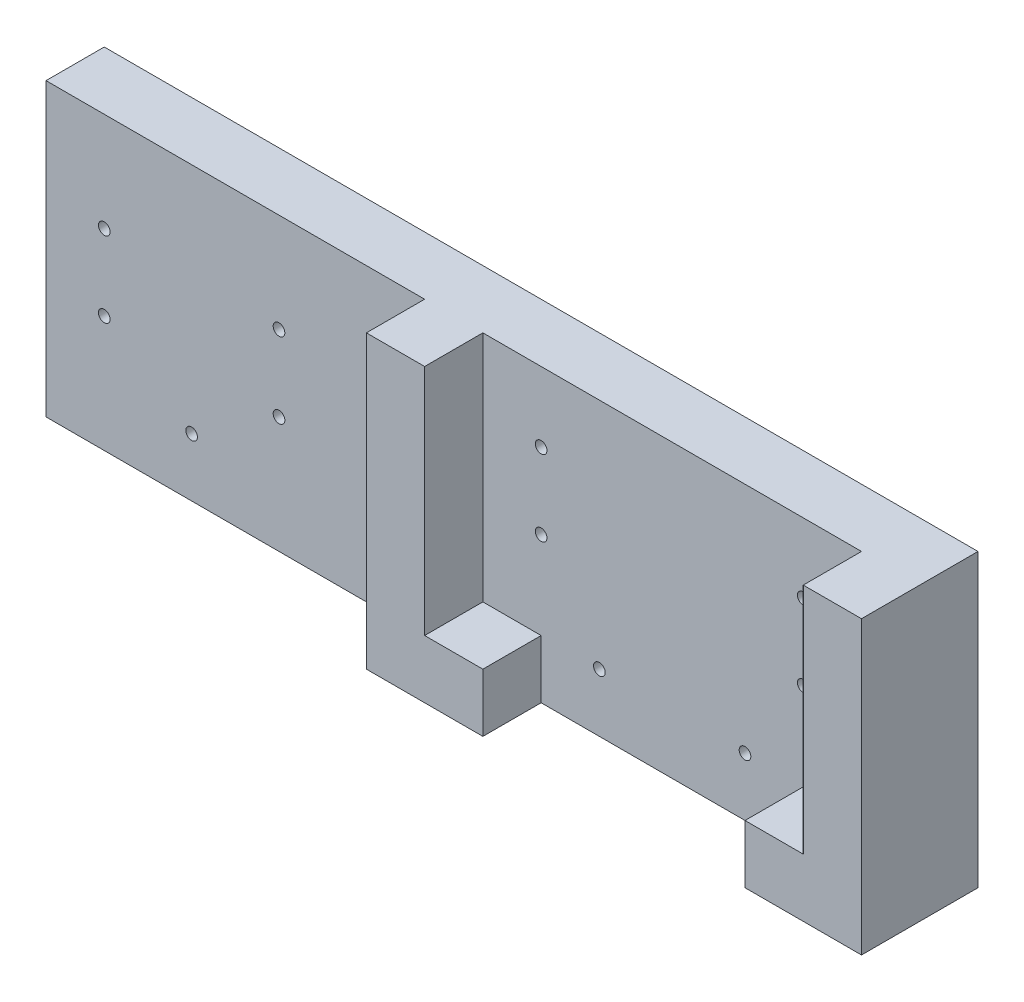
ISO-10303-21;
HEADER;
FILE_DESCRIPTION(('STEP AP214'),'2;1');
FILE_NAME('part.step','',(''),(''),'','','');
FILE_SCHEMA(('AUTOMOTIVE_DESIGN { 1 0 10303 214 1 1 1 1 }'));
ENDSEC;
DATA;
#1=APPLICATION_CONTEXT('core data for automotive mechanical design processes');
#2=APPLICATION_PROTOCOL_DEFINITION('international standard','automotive_design',2000,#1);
#3=PRODUCT_CONTEXT('',#1,'mechanical');
#4=PRODUCT('Part','Part','',(#3));
#5=PRODUCT_RELATED_PRODUCT_CATEGORY('part','',(#4));
#6=PRODUCT_DEFINITION_FORMATION('','',#4);
#7=PRODUCT_DEFINITION_CONTEXT('part definition',#1,'design');
#8=PRODUCT_DEFINITION('design','',#6,#7);
#9=PRODUCT_DEFINITION_SHAPE('','',#8);
#10=(LENGTH_UNIT() NAMED_UNIT(*) SI_UNIT(.MILLI.,.METRE.));
#11=(NAMED_UNIT(*) PLANE_ANGLE_UNIT() SI_UNIT($,.RADIAN.));
#12=(NAMED_UNIT(*) SI_UNIT($,.STERADIAN.) SOLID_ANGLE_UNIT());
#13=UNCERTAINTY_MEASURE_WITH_UNIT(LENGTH_MEASURE(1.E-05),#10,'distance_accuracy_value','');
#14=(GEOMETRIC_REPRESENTATION_CONTEXT(3) GLOBAL_UNCERTAINTY_ASSIGNED_CONTEXT((#13)) GLOBAL_UNIT_ASSIGNED_CONTEXT((#10,
#11,#12)) REPRESENTATION_CONTEXT('',''));
#15=CARTESIAN_POINT('',(0.,0.,0.));
#16=DIRECTION('',(0.,0.,1.));
#17=DIRECTION('',(1.,0.,0.));
#18=AXIS2_PLACEMENT_3D('',#15,#16,#17);
#19=CARTESIAN_POINT('',(0.,0.,-20.));
#20=DIRECTION('',(0.,0.,1.));
#21=DIRECTION('',(1.,0.,0.));
#22=AXIS2_PLACEMENT_3D('',#19,#20,#21);
#23=PLANE('',#22);
#24=CARTESIAN_POINT('',(-61.1414341617116,19.5358217023107,-20.));
#25=DIRECTION('',(0.,0.,-1.));
#26=DIRECTION('',(-1.,0.,0.));
#27=AXIS2_PLACEMENT_3D('',#24,#25,#26);
#28=CIRCLE('',#27,1.00000000000001);
#29=CARTESIAN_POINT('',(-62.1414341617116,19.5358217023107,-20.));
#30=VERTEX_POINT('',#29);
#31=EDGE_CURVE('E223',#30,#30,#28,.T.);
#32=ORIENTED_EDGE('',*,*,#31,.T.);
#33=EDGE_LOOP('',(#32));
#34=FACE_BOUND('',#33,.T.);
#35=CARTESIAN_POINT('',(-46.1414341617116,42.5358217023106,-20.));
#36=DIRECTION('',(0.,0.,-1.));
#37=DIRECTION('',(-1.,0.,0.));
#38=AXIS2_PLACEMENT_3D('',#35,#36,#37);
#39=CIRCLE('',#38,0.999999999999998);
#40=CARTESIAN_POINT('',(-47.1414341617116,42.5358217023106,-20.));
#41=VERTEX_POINT('',#40);
#42=EDGE_CURVE('E233',#41,#41,#39,.T.);
#43=ORIENTED_EDGE('',*,*,#42,.T.);
#44=EDGE_LOOP('',(#43));
#45=FACE_BOUND('',#44,.T.);
#46=CARTESIAN_POINT('',(-76.1414341617116,29.5358217023107,-20.));
#47=DIRECTION('',(0.,0.,-1.));
#48=DIRECTION('',(-1.,0.,0.));
#49=AXIS2_PLACEMENT_3D('',#46,#47,#48);
#50=CIRCLE('',#49,1.00000000000001);
#51=CARTESIAN_POINT('',(-77.1414341617117,29.5358217023107,-20.));
#52=VERTEX_POINT('',#51);
#53=EDGE_CURVE('E245',#52,#52,#50,.T.);
#54=ORIENTED_EDGE('',*,*,#53,.T.);
#55=EDGE_LOOP('',(#54));
#56=FACE_BOUND('',#55,.T.);
#57=CARTESIAN_POINT('',(-76.1414341617116,42.5358217023106,-20.));
#58=DIRECTION('',(0.,0.,-1.));
#59=DIRECTION('',(-1.,0.,0.));
#60=AXIS2_PLACEMENT_3D('',#57,#58,#59);
#61=CIRCLE('',#60,1.00000000000001);
#62=CARTESIAN_POINT('',(-77.1414341617117,42.5358217023106,-20.));
#63=VERTEX_POINT('',#62);
#64=EDGE_CURVE('E239',#63,#63,#61,.T.);
#65=ORIENTED_EDGE('',*,*,#64,.T.);
#66=EDGE_LOOP('',(#65));
#67=FACE_BOUND('',#66,.T.);
#68=CARTESIAN_POINT('',(-46.1414341617116,29.5358217023107,-20.));
#69=DIRECTION('',(0.,0.,-1.));
#70=DIRECTION('',(-1.,0.,0.));
#71=AXIS2_PLACEMENT_3D('',#68,#69,#70);
#72=CIRCLE('',#71,0.999999999999998);
#73=CARTESIAN_POINT('',(-47.1414341617116,29.5358217023107,-20.));
#74=VERTEX_POINT('',#73);
#75=EDGE_CURVE('E227',#74,#74,#72,.T.);
#76=ORIENTED_EDGE('',*,*,#75,.T.);
#77=EDGE_LOOP('',(#76));
#78=FACE_BOUND('',#77,.T.);
#79=DIRECTION('',(-1.,0.,0.));
#80=VECTOR('',#79,1.);
#81=CARTESIAN_POINT('',(63.8585658382884,9.53582170231052,-20.));
#82=LINE('',#81,#80);
#83=CARTESIAN_POINT('',(-21.1414341617117,9.53582170231054,-20.));
#84=VERTEX_POINT('',#83);
#85=CARTESIAN_POINT('',(-86.1414341617116,9.53582170231056,-20.));
#86=VERTEX_POINT('',#85);
#87=EDGE_CURVE('E304',#84,#86,#82,.T.);
#88=ORIENTED_EDGE('',*,*,#87,.F.);
#89=DIRECTION('',(0.,1.,0.));
#90=VECTOR('',#89,1.);
#91=CARTESIAN_POINT('',(-21.1414341617117,0.,-20.));
#92=LINE('',#91,#90);
#93=CARTESIAN_POINT('',(-21.1414341617117,59.5358217023105,-20.));
#94=VERTEX_POINT('',#93);
#95=EDGE_CURVE('E203',#84,#94,#92,.T.);
#96=ORIENTED_EDGE('',*,*,#95,.T.);
#97=DIRECTION('',(1.,0.,0.));
#98=VECTOR('',#97,1.);
#99=CARTESIAN_POINT('',(63.8585658382884,59.5358217023105,-20.));
#100=LINE('',#99,#98);
#101=CARTESIAN_POINT('',(-86.1414341617116,59.5358217023106,-20.));
#102=VERTEX_POINT('',#101);
#103=EDGE_CURVE('E301',#102,#94,#100,.T.);
#104=ORIENTED_EDGE('',*,*,#103,.F.);
#105=DIRECTION('',(0.,1.,0.));
#106=VECTOR('',#105,1.);
#107=CARTESIAN_POINT('',(-86.1414341617116,59.5358217023106,-20.));
#108=LINE('',#107,#106);
#109=EDGE_CURVE('E294',#86,#102,#108,.T.);
#110=ORIENTED_EDGE('',*,*,#109,.F.);
#111=EDGE_LOOP('',(#88,#96,#104,#110));
#112=FACE_BOUND('',#111,.T.);
#113=ADVANCED_FACE('F39',(#34,#45,#56,#67,#78,#112),#23,.T.);
#114=CARTESIAN_POINT('',(0.,0.,-30.));
#115=DIRECTION('',(0.,0.,1.));
#116=DIRECTION('',(1.,0.,0.));
#117=AXIS2_PLACEMENT_3D('',#114,#115,#116);
#118=PLANE('',#117);
#119=DIRECTION('',(1.,0.,0.));
#120=VECTOR('',#119,1.);
#121=CARTESIAN_POINT('',(63.8585658382884,59.5358217023105,-30.));
#122=LINE('',#121,#120);
#123=CARTESIAN_POINT('',(-86.1414341617116,59.5358217023106,-30.));
#124=VERTEX_POINT('',#123);
#125=CARTESIAN_POINT('',(63.8585658382884,59.5358217023105,-30.));
#126=VERTEX_POINT('',#125);
#127=EDGE_CURVE('E290',#124,#126,#122,.T.);
#128=ORIENTED_EDGE('',*,*,#127,.T.);
#129=DIRECTION('',(0.,-1.,0.));
#130=VECTOR('',#129,1.);
#131=CARTESIAN_POINT('',(63.8585658382884,59.5358217023105,-30.));
#132=LINE('',#131,#130);
#133=CARTESIAN_POINT('',(63.8585658382884,9.53582170231052,-30.));
#134=VERTEX_POINT('',#133);
#135=EDGE_CURVE('E293',#126,#134,#132,.T.);
#136=ORIENTED_EDGE('',*,*,#135,.T.);
#137=DIRECTION('',(-1.,0.,0.));
#138=VECTOR('',#137,1.);
#139=CARTESIAN_POINT('',(63.8585658382884,9.53582170231052,-30.));
#140=LINE('',#139,#138);
#141=CARTESIAN_POINT('',(-86.1414341617116,9.53582170231056,-30.));
#142=VERTEX_POINT('',#141);
#143=EDGE_CURVE('E296',#134,#142,#140,.T.);
#144=ORIENTED_EDGE('',*,*,#143,.T.);
#145=DIRECTION('',(0.,1.,0.));
#146=VECTOR('',#145,1.);
#147=CARTESIAN_POINT('',(-86.1414341617116,59.5358217023106,-30.));
#148=LINE('',#147,#146);
#149=EDGE_CURVE('E298',#142,#124,#148,.T.);
#150=ORIENTED_EDGE('',*,*,#149,.T.);
#151=EDGE_LOOP('',(#128,#136,#144,#150));
#152=FACE_BOUND('',#151,.T.);
#153=CARTESIAN_POINT('',(43.8585658382883,47.5358217023105,-30.));
#154=DIRECTION('',(0.,0.,-1.));
#155=DIRECTION('',(-1.,0.,0.));
#156=AXIS2_PLACEMENT_3D('',#153,#154,#155);
#157=CIRCLE('',#156,0.999999999999998);
#158=CARTESIAN_POINT('',(42.8585658382883,47.5358217023105,-30.));
#159=VERTEX_POINT('',#158);
#160=EDGE_CURVE('E284',#159,#159,#157,.T.);
#161=ORIENTED_EDGE('',*,*,#160,.F.);
#162=EDGE_LOOP('',(#161));
#163=FACE_BOUND('',#162,.T.);
#164=CARTESIAN_POINT('',(43.8585658382884,34.5358217023105,-30.));
#165=DIRECTION('',(0.,0.,-1.));
#166=DIRECTION('',(-1.,0.,0.));
#167=AXIS2_PLACEMENT_3D('',#164,#165,#166);
#168=CIRCLE('',#167,1.00000000000001);
#169=CARTESIAN_POINT('',(42.8585658382883,34.5358217023105,-30.));
#170=VERTEX_POINT('',#169);
#171=EDGE_CURVE('E278',#170,#170,#168,.T.);
#172=ORIENTED_EDGE('',*,*,#171,.F.);
#173=EDGE_LOOP('',(#172));
#174=FACE_BOUND('',#173,.T.);
#175=CARTESIAN_POINT('',(-1.14143416171164,34.5358217023105,-30.));
#176=DIRECTION('',(0.,0.,-1.));
#177=DIRECTION('',(-1.,0.,0.));
#178=AXIS2_PLACEMENT_3D('',#175,#176,#177);
#179=CIRCLE('',#178,1.);
#180=CARTESIAN_POINT('',(-2.14143416171164,34.5358217023105,-30.));
#181=VERTEX_POINT('',#180);
#182=EDGE_CURVE('E272',#181,#181,#179,.T.);
#183=ORIENTED_EDGE('',*,*,#182,.F.);
#184=EDGE_LOOP('',(#183));
#185=FACE_BOUND('',#184,.T.);
#186=CARTESIAN_POINT('',(-1.1414341617116,47.5358217023105,-30.));
#187=DIRECTION('',(0.,0.,-1.));
#188=DIRECTION('',(-1.,0.,0.));
#189=AXIS2_PLACEMENT_3D('',#186,#187,#188);
#190=CIRCLE('',#189,0.999999999999933);
#191=CARTESIAN_POINT('',(-2.14143416171153,47.5358217023105,-30.));
#192=VERTEX_POINT('',#191);
#193=EDGE_CURVE('E266',#192,#192,#190,.T.);
#194=ORIENTED_EDGE('',*,*,#193,.F.);
#195=EDGE_LOOP('',(#194));
#196=FACE_BOUND('',#195,.T.);
#197=CARTESIAN_POINT('',(8.85856583828836,19.5358217023105,-30.));
#198=DIRECTION('',(0.,0.,-1.));
#199=DIRECTION('',(-1.,0.,0.));
#200=AXIS2_PLACEMENT_3D('',#197,#198,#199);
#201=CIRCLE('',#200,1.);
#202=CARTESIAN_POINT('',(7.85856583828836,19.5358217023105,-30.));
#203=VERTEX_POINT('',#202);
#204=EDGE_CURVE('E260',#203,#203,#201,.T.);
#205=ORIENTED_EDGE('',*,*,#204,.F.);
#206=EDGE_LOOP('',(#205));
#207=FACE_BOUND('',#206,.T.);
#208=CARTESIAN_POINT('',(33.8585658382884,19.5358217023105,-30.));
#209=DIRECTION('',(0.,0.,-1.));
#210=DIRECTION('',(-1.,0.,0.));
#211=AXIS2_PLACEMENT_3D('',#208,#209,#210);
#212=CIRCLE('',#211,0.999999999999998);
#213=CARTESIAN_POINT('',(32.8585658382884,19.5358217023105,-30.));
#214=VERTEX_POINT('',#213);
#215=EDGE_CURVE('E254',#214,#214,#212,.T.);
#216=ORIENTED_EDGE('',*,*,#215,.F.);
#217=EDGE_LOOP('',(#216));
#218=FACE_BOUND('',#217,.T.);
#219=CARTESIAN_POINT('',(-76.1414341617116,29.5358217023107,-30.));
#220=DIRECTION('',(0.,0.,-1.));
#221=DIRECTION('',(-1.,0.,0.));
#222=AXIS2_PLACEMENT_3D('',#219,#220,#221);
#223=CIRCLE('',#222,1.00000000000001);
#224=CARTESIAN_POINT('',(-77.1414341617117,29.5358217023107,-30.));
#225=VERTEX_POINT('',#224);
#226=EDGE_CURVE('E248',#225,#225,#223,.T.);
#227=ORIENTED_EDGE('',*,*,#226,.F.);
#228=EDGE_LOOP('',(#227));
#229=FACE_BOUND('',#228,.T.);
#230=CARTESIAN_POINT('',(-76.1414341617116,42.5358217023106,-30.));
#231=DIRECTION('',(0.,0.,-1.));
#232=DIRECTION('',(-1.,0.,0.));
#233=AXIS2_PLACEMENT_3D('',#230,#231,#232);
#234=CIRCLE('',#233,1.00000000000001);
#235=CARTESIAN_POINT('',(-77.1414341617117,42.5358217023106,-30.));
#236=VERTEX_POINT('',#235);
#237=EDGE_CURVE('E242',#236,#236,#234,.T.);
#238=ORIENTED_EDGE('',*,*,#237,.F.);
#239=EDGE_LOOP('',(#238));
#240=FACE_BOUND('',#239,.T.);
#241=CARTESIAN_POINT('',(-46.1414341617116,42.5358217023106,-30.));
#242=DIRECTION('',(0.,0.,-1.));
#243=DIRECTION('',(-1.,0.,0.));
#244=AXIS2_PLACEMENT_3D('',#241,#242,#243);
#245=CIRCLE('',#244,0.999999999999998);
#246=CARTESIAN_POINT('',(-47.1414341617116,42.5358217023106,-30.));
#247=VERTEX_POINT('',#246);
#248=EDGE_CURVE('E236',#247,#247,#245,.T.);
#249=ORIENTED_EDGE('',*,*,#248,.F.);
#250=EDGE_LOOP('',(#249));
#251=FACE_BOUND('',#250,.T.);
#252=CARTESIAN_POINT('',(-46.1414341617116,29.5358217023107,-30.));
#253=DIRECTION('',(0.,0.,-1.));
#254=DIRECTION('',(-1.,0.,0.));
#255=AXIS2_PLACEMENT_3D('',#252,#253,#254);
#256=CIRCLE('',#255,0.999999999999998);
#257=CARTESIAN_POINT('',(-47.1414341617116,29.5358217023107,-30.));
#258=VERTEX_POINT('',#257);
#259=EDGE_CURVE('E230',#258,#258,#256,.T.);
#260=ORIENTED_EDGE('',*,*,#259,.F.);
#261=EDGE_LOOP('',(#260));
#262=FACE_BOUND('',#261,.T.);
#263=CARTESIAN_POINT('',(-61.1414341617116,19.5358217023107,-30.));
#264=DIRECTION('',(0.,0.,-1.));
#265=DIRECTION('',(-1.,0.,0.));
#266=AXIS2_PLACEMENT_3D('',#263,#264,#265);
#267=CIRCLE('',#266,1.00000000000001);
#268=CARTESIAN_POINT('',(-62.1414341617116,19.5358217023107,-30.));
#269=VERTEX_POINT('',#268);
#270=EDGE_CURVE('E224',#269,#269,#267,.T.);
#271=ORIENTED_EDGE('',*,*,#270,.F.);
#272=EDGE_LOOP('',(#271));
#273=FACE_BOUND('',#272,.T.);
#274=ADVANCED_FACE('F341',(#152,#163,#174,#185,#196,#207,#218,#229,#240,#251,#262,#273),#118,.F.);
#275=DIRECTION('',(0.,1.,0.));
#276=VECTOR('',#275,1.);
#277=CARTESIAN_POINT('',(53.8585658382884,0.,-20.));
#278=LINE('',#277,#276);
#279=CARTESIAN_POINT('',(53.8585658382884,19.5358217023105,-20.));
#280=VERTEX_POINT('',#279);
#281=CARTESIAN_POINT('',(53.8585658382883,59.5358217023105,-20.));
#282=VERTEX_POINT('',#281);
#283=EDGE_CURVE('E145',#280,#282,#278,.T.);
#284=ORIENTED_EDGE('',*,*,#283,.T.);
#285=CARTESIAN_POINT('',(-11.1414341617117,59.5358217023105,-20.));
#286=VERTEX_POINT('',#285);
#287=EDGE_CURVE('E287',#286,#282,#100,.T.);
#288=ORIENTED_EDGE('',*,*,#287,.F.);
#289=DIRECTION('',(0.,1.,0.));
#290=VECTOR('',#289,1.);
#291=CARTESIAN_POINT('',(-11.1414341617117,0.,-20.));
#292=LINE('',#291,#290);
#293=CARTESIAN_POINT('',(-11.1414341617117,19.5358217023105,-20.));
#294=VERTEX_POINT('',#293);
#295=EDGE_CURVE('E200',#294,#286,#292,.T.);
#296=ORIENTED_EDGE('',*,*,#295,.F.);
#297=DIRECTION('',(1.,0.,0.));
#298=VECTOR('',#297,1.);
#299=CARTESIAN_POINT('',(0.,19.5358217023105,-20.));
#300=LINE('',#299,#298);
#301=CARTESIAN_POINT('',(-1.14143416171164,19.5358217023105,-20.));
#302=VERTEX_POINT('',#301);
#303=EDGE_CURVE('E62',#294,#302,#300,.T.);
#304=ORIENTED_EDGE('',*,*,#303,.T.);
#305=DIRECTION('',(0.,1.,0.));
#306=VECTOR('',#305,1.);
#307=CARTESIAN_POINT('',(-1.14143416171164,0.,-20.));
#308=LINE('',#307,#306);
#309=CARTESIAN_POINT('',(-1.14143416171164,9.53582170231054,-20.));
#310=VERTEX_POINT('',#309);
#311=EDGE_CURVE('E187',#310,#302,#308,.T.);
#312=ORIENTED_EDGE('',*,*,#311,.F.);
#313=CARTESIAN_POINT('',(43.8585658382884,9.53582170231052,-20.));
#314=VERTEX_POINT('',#313);
#315=EDGE_CURVE('E305',#314,#310,#82,.T.);
#316=ORIENTED_EDGE('',*,*,#315,.F.);
#317=DIRECTION('',(0.,1.,0.));
#318=VECTOR('',#317,1.);
#319=CARTESIAN_POINT('',(43.8585658382884,0.,-20.));
#320=LINE('',#319,#318);
#321=CARTESIAN_POINT('',(43.8585658382884,19.5358217023105,-20.));
#322=VERTEX_POINT('',#321);
#323=EDGE_CURVE('E54',#314,#322,#320,.T.);
#324=ORIENTED_EDGE('',*,*,#323,.T.);
#325=DIRECTION('',(1.,0.,0.));
#326=VECTOR('',#325,1.);
#327=CARTESIAN_POINT('',(0.,19.5358217023105,-20.));
#328=LINE('',#327,#326);
#329=EDGE_CURVE('E176',#322,#280,#328,.T.);
#330=ORIENTED_EDGE('',*,*,#329,.T.);
#331=EDGE_LOOP('',(#284,#288,#296,#304,#312,#316,#324,#330));
#332=FACE_BOUND('',#331,.T.);
#333=CARTESIAN_POINT('',(33.8585658382884,19.5358217023105,-20.));
#334=DIRECTION('',(0.,0.,-1.));
#335=DIRECTION('',(-1.,0.,0.));
#336=AXIS2_PLACEMENT_3D('',#333,#334,#335);
#337=CIRCLE('',#336,0.999999999999998);
#338=CARTESIAN_POINT('',(32.8585658382884,19.5358217023105,-20.));
#339=VERTEX_POINT('',#338);
#340=EDGE_CURVE('E251',#339,#339,#337,.T.);
#341=ORIENTED_EDGE('',*,*,#340,.T.);
#342=EDGE_LOOP('',(#341));
#343=FACE_BOUND('',#342,.T.);
#344=CARTESIAN_POINT('',(-1.1414341617116,47.5358217023105,-20.));
#345=DIRECTION('',(0.,0.,-1.));
#346=DIRECTION('',(-1.,0.,0.));
#347=AXIS2_PLACEMENT_3D('',#344,#345,#346);
#348=CIRCLE('',#347,0.999999999999933);
#349=CARTESIAN_POINT('',(-2.14143416171153,47.5358217023105,-20.));
#350=VERTEX_POINT('',#349);
#351=EDGE_CURVE('E263',#350,#350,#348,.T.);
#352=ORIENTED_EDGE('',*,*,#351,.T.);
#353=EDGE_LOOP('',(#352));
#354=FACE_BOUND('',#353,.T.);
#355=CARTESIAN_POINT('',(43.8585658382884,34.5358217023105,-20.));
#356=DIRECTION('',(0.,0.,-1.));
#357=DIRECTION('',(-1.,0.,0.));
#358=AXIS2_PLACEMENT_3D('',#355,#356,#357);
#359=CIRCLE('',#358,1.00000000000001);
#360=CARTESIAN_POINT('',(42.8585658382883,34.5358217023105,-20.));
#361=VERTEX_POINT('',#360);
#362=EDGE_CURVE('E275',#361,#361,#359,.T.);
#363=ORIENTED_EDGE('',*,*,#362,.T.);
#364=EDGE_LOOP('',(#363));
#365=FACE_BOUND('',#364,.T.);
#366=CARTESIAN_POINT('',(43.8585658382883,47.5358217023105,-20.));
#367=DIRECTION('',(0.,0.,-1.));
#368=DIRECTION('',(-1.,0.,0.));
#369=AXIS2_PLACEMENT_3D('',#366,#367,#368);
#370=CIRCLE('',#369,0.999999999999998);
#371=CARTESIAN_POINT('',(42.8585658382883,47.5358217023105,-20.));
#372=VERTEX_POINT('',#371);
#373=EDGE_CURVE('E281',#372,#372,#370,.T.);
#374=ORIENTED_EDGE('',*,*,#373,.T.);
#375=EDGE_LOOP('',(#374));
#376=FACE_BOUND('',#375,.T.);
#377=CARTESIAN_POINT('',(-1.14143416171164,34.5358217023105,-20.));
#378=DIRECTION('',(0.,0.,-1.));
#379=DIRECTION('',(-1.,0.,0.));
#380=AXIS2_PLACEMENT_3D('',#377,#378,#379);
#381=CIRCLE('',#380,1.);
#382=CARTESIAN_POINT('',(-2.14143416171164,34.5358217023105,-20.));
#383=VERTEX_POINT('',#382);
#384=EDGE_CURVE('E269',#383,#383,#381,.T.);
#385=ORIENTED_EDGE('',*,*,#384,.T.);
#386=EDGE_LOOP('',(#385));
#387=FACE_BOUND('',#386,.T.);
#388=CARTESIAN_POINT('',(8.85856583828836,19.5358217023105,-20.));
#389=DIRECTION('',(0.,0.,-1.));
#390=DIRECTION('',(-1.,0.,0.));
#391=AXIS2_PLACEMENT_3D('',#388,#389,#390);
#392=CIRCLE('',#391,1.);
#393=CARTESIAN_POINT('',(7.85856583828836,19.5358217023105,-20.));
#394=VERTEX_POINT('',#393);
#395=EDGE_CURVE('E257',#394,#394,#392,.T.);
#396=ORIENTED_EDGE('',*,*,#395,.T.);
#397=EDGE_LOOP('',(#396));
#398=FACE_BOUND('',#397,.T.);
#399=ADVANCED_FACE('F325',(#332,#343,#354,#365,#376,#387,#398),#23,.T.);
#400=CARTESIAN_POINT('',(63.8585658382884,59.5358217023105,-30.));
#401=DIRECTION('',(0.,-1.,0.));
#402=DIRECTION('',(1.,0.,0.));
#403=AXIS2_PLACEMENT_3D('',#400,#401,#402);
#404=PLANE('',#403);
#405=ORIENTED_EDGE('',*,*,#103,.T.);
#406=DIRECTION('',(0.,0.,-1.));
#407=VECTOR('',#406,1.);
#408=CARTESIAN_POINT('',(-21.1414341617117,59.5358217023106,-10.));
#409=LINE('',#408,#407);
#410=CARTESIAN_POINT('',(-21.1414341617117,59.5358217023106,-10.));
#411=VERTEX_POINT('',#410);
#412=EDGE_CURVE('E214',#411,#94,#409,.T.);
#413=ORIENTED_EDGE('',*,*,#412,.F.);
#414=DIRECTION('',(-1.,0.,0.));
#415=VECTOR('',#414,1.);
#416=CARTESIAN_POINT('',(0.,59.5358217023105,-10.));
#417=LINE('',#416,#415);
#418=CARTESIAN_POINT('',(-11.1414341617117,59.5358217023105,-10.));
#419=VERTEX_POINT('',#418);
#420=EDGE_CURVE('E189',#419,#411,#417,.T.);
#421=ORIENTED_EDGE('',*,*,#420,.F.);
#422=DIRECTION('',(0.,0.,-1.));
#423=VECTOR('',#422,1.);
#424=CARTESIAN_POINT('',(-11.1414341617117,59.5358217023105,-10.));
#425=LINE('',#424,#423);
#426=EDGE_CURVE('E217',#419,#286,#425,.T.);
#427=ORIENTED_EDGE('',*,*,#426,.T.);
#428=ORIENTED_EDGE('',*,*,#287,.T.);
#429=DIRECTION('',(0.,0.,-1.));
#430=VECTOR('',#429,1.);
#431=CARTESIAN_POINT('',(53.8585658382883,59.5358217023105,-10.));
#432=LINE('',#431,#430);
#433=CARTESIAN_POINT('',(53.8585658382883,59.5358217023105,-10.));
#434=VERTEX_POINT('',#433);
#435=EDGE_CURVE('E174',#434,#282,#432,.T.);
#436=ORIENTED_EDGE('',*,*,#435,.F.);
#437=DIRECTION('',(-1.,0.,0.));
#438=VECTOR('',#437,1.);
#439=CARTESIAN_POINT('',(0.,59.5358217023105,-10.));
#440=LINE('',#439,#438);
#441=CARTESIAN_POINT('',(63.8585658382884,59.5358217023105,-10.));
#442=VERTEX_POINT('',#441);
#443=EDGE_CURVE('E160',#442,#434,#440,.T.);
#444=ORIENTED_EDGE('',*,*,#443,.F.);
#445=DIRECTION('',(0.,0.,1.));
#446=VECTOR('',#445,1.);
#447=CARTESIAN_POINT('',(63.8585658382884,59.5358217023105,-30.));
#448=LINE('',#447,#446);
#449=EDGE_CURVE('E11',#126,#442,#448,.T.);
#450=ORIENTED_EDGE('',*,*,#449,.F.);
#451=ORIENTED_EDGE('',*,*,#127,.F.);
#452=DIRECTION('',(0.,0.,1.));
#453=VECTOR('',#452,1.);
#454=CARTESIAN_POINT('',(-86.1414341617116,59.5358217023106,-30.));
#455=LINE('',#454,#453);
#456=EDGE_CURVE('E300',#124,#102,#455,.T.);
#457=ORIENTED_EDGE('',*,*,#456,.T.);
#458=EDGE_LOOP('',(#405,#413,#421,#427,#428,#436,#444,#450,#451,#457));
#459=FACE_BOUND('',#458,.T.);
#460=ADVANCED_FACE('F41',(#459),#404,.F.);
#461=CARTESIAN_POINT('',(63.8585658382884,59.5358217023105,-30.));
#462=DIRECTION('',(-1.,0.,0.));
#463=DIRECTION('',(0.,0.,1.));
#464=AXIS2_PLACEMENT_3D('',#461,#462,#463);
#465=PLANE('',#464);
#466=ORIENTED_EDGE('',*,*,#449,.T.);
#467=DIRECTION('',(0.,1.,0.));
#468=VECTOR('',#467,1.);
#469=CARTESIAN_POINT('',(63.8585658382884,0.,-10.));
#470=LINE('',#469,#468);
#471=CARTESIAN_POINT('',(63.8585658382884,9.53582170231052,-10.));
#472=VERTEX_POINT('',#471);
#473=EDGE_CURVE('E171',#472,#442,#470,.T.);
#474=ORIENTED_EDGE('',*,*,#473,.F.);
#475=DIRECTION('',(0.,0.,1.));
#476=VECTOR('',#475,1.);
#477=CARTESIAN_POINT('',(63.8585658382884,9.53582170231052,-30.));
#478=LINE('',#477,#476);
#479=EDGE_CURVE('E47',#134,#472,#478,.T.);
#480=ORIENTED_EDGE('',*,*,#479,.F.);
#481=ORIENTED_EDGE('',*,*,#135,.F.);
#482=EDGE_LOOP('',(#466,#474,#480,#481));
#483=FACE_BOUND('',#482,.T.);
#484=ADVANCED_FACE('F320',(#483),#465,.F.);
#485=CARTESIAN_POINT('',(63.8585658382884,9.53582170231052,-30.));
#486=DIRECTION('',(0.,1.,0.));
#487=DIRECTION('',(-1.,0.,0.));
#488=AXIS2_PLACEMENT_3D('',#485,#486,#487);
#489=PLANE('',#488);
#490=ORIENTED_EDGE('',*,*,#479,.T.);
#491=DIRECTION('',(1.,0.,0.));
#492=VECTOR('',#491,1.);
#493=CARTESIAN_POINT('',(0.,9.53582170231054,-10.));
#494=LINE('',#493,#492);
#495=CARTESIAN_POINT('',(43.8585658382884,9.53582170231052,-10.));
#496=VERTEX_POINT('',#495);
#497=EDGE_CURVE('E166',#496,#472,#494,.T.);
#498=ORIENTED_EDGE('',*,*,#497,.F.);
#499=DIRECTION('',(0.,0.,-1.));
#500=VECTOR('',#499,1.);
#501=CARTESIAN_POINT('',(43.8585658382884,9.53582170231052,-10.));
#502=LINE('',#501,#500);
#503=EDGE_CURVE('E180',#496,#314,#502,.T.);
#504=ORIENTED_EDGE('',*,*,#503,.T.);
#505=ORIENTED_EDGE('',*,*,#315,.T.);
#506=DIRECTION('',(0.,0.,-1.));
#507=VECTOR('',#506,1.);
#508=CARTESIAN_POINT('',(-1.14143416171164,9.53582170231054,-10.));
#509=LINE('',#508,#507);
#510=CARTESIAN_POINT('',(-1.14143416171164,9.53582170231054,-10.));
#511=VERTEX_POINT('',#510);
#512=EDGE_CURVE('E208',#511,#310,#509,.T.);
#513=ORIENTED_EDGE('',*,*,#512,.F.);
#514=DIRECTION('',(1.,0.,0.));
#515=VECTOR('',#514,1.);
#516=CARTESIAN_POINT('',(0.,9.53582170231054,-10.));
#517=LINE('',#516,#515);
#518=CARTESIAN_POINT('',(-21.1414341617117,9.53582170231054,-10.));
#519=VERTEX_POINT('',#518);
#520=EDGE_CURVE('E194',#519,#511,#517,.T.);
#521=ORIENTED_EDGE('',*,*,#520,.F.);
#522=DIRECTION('',(0.,0.,-1.));
#523=VECTOR('',#522,1.);
#524=CARTESIAN_POINT('',(-21.1414341617117,9.53582170231054,-10.));
#525=LINE('',#524,#523);
#526=EDGE_CURVE('E211',#519,#84,#525,.T.);
#527=ORIENTED_EDGE('',*,*,#526,.T.);
#528=ORIENTED_EDGE('',*,*,#87,.T.);
#529=DIRECTION('',(0.,0.,1.));
#530=VECTOR('',#529,1.);
#531=CARTESIAN_POINT('',(-86.1414341617116,9.53582170231056,-30.));
#532=LINE('',#531,#530);
#533=EDGE_CURVE('E310',#142,#86,#532,.T.);
#534=ORIENTED_EDGE('',*,*,#533,.F.);
#535=ORIENTED_EDGE('',*,*,#143,.F.);
#536=EDGE_LOOP('',(#490,#498,#504,#505,#513,#521,#527,#528,#534,#535));
#537=FACE_BOUND('',#536,.T.);
#538=ADVANCED_FACE('F316',(#537),#489,.F.);
#539=CARTESIAN_POINT('',(-86.1414341617116,59.5358217023106,-30.));
#540=DIRECTION('',(1.,0.,0.));
#541=DIRECTION('',(0.,1.,0.));
#542=AXIS2_PLACEMENT_3D('',#539,#540,#541);
#543=PLANE('',#542);
#544=ORIENTED_EDGE('',*,*,#109,.T.);
#545=ORIENTED_EDGE('',*,*,#456,.F.);
#546=ORIENTED_EDGE('',*,*,#149,.F.);
#547=ORIENTED_EDGE('',*,*,#533,.T.);
#548=EDGE_LOOP('',(#544,#545,#546,#547));
#549=FACE_BOUND('',#548,.T.);
#550=ADVANCED_FACE('F361',(#549),#543,.F.);
#551=CARTESIAN_POINT('',(43.8585658382883,47.5358217023105,-30.));
#552=DIRECTION('',(0.,0.,1.));
#553=DIRECTION('',(1.,0.,0.));
#554=AXIS2_PLACEMENT_3D('',#551,#552,#553);
#555=CYLINDRICAL_SURFACE('',#554,0.999999999999998);
#556=ORIENTED_EDGE('',*,*,#160,.T.);
#557=EDGE_LOOP('',(#556));
#558=FACE_BOUND('',#557,.T.);
#559=ORIENTED_EDGE('',*,*,#373,.F.);
#560=EDGE_LOOP('',(#559));
#561=FACE_BOUND('',#560,.T.);
#562=ADVANCED_FACE('F364',(#558,#561),#555,.F.);
#563=CARTESIAN_POINT('',(43.8585658382884,34.5358217023105,-30.));
#564=DIRECTION('',(0.,0.,1.));
#565=DIRECTION('',(1.,0.,0.));
#566=AXIS2_PLACEMENT_3D('',#563,#564,#565);
#567=CYLINDRICAL_SURFACE('',#566,1.00000000000001);
#568=ORIENTED_EDGE('',*,*,#171,.T.);
#569=EDGE_LOOP('',(#568));
#570=FACE_BOUND('',#569,.T.);
#571=ORIENTED_EDGE('',*,*,#362,.F.);
#572=EDGE_LOOP('',(#571));
#573=FACE_BOUND('',#572,.T.);
#574=ADVANCED_FACE('F369',(#570,#573),#567,.F.);
#575=CARTESIAN_POINT('',(-1.14143416171164,34.5358217023105,-30.));
#576=DIRECTION('',(0.,0.,1.));
#577=DIRECTION('',(1.,0.,0.));
#578=AXIS2_PLACEMENT_3D('',#575,#576,#577);
#579=CYLINDRICAL_SURFACE('',#578,1.);
#580=ORIENTED_EDGE('',*,*,#182,.T.);
#581=EDGE_LOOP('',(#580));
#582=FACE_BOUND('',#581,.T.);
#583=ORIENTED_EDGE('',*,*,#384,.F.);
#584=EDGE_LOOP('',(#583));
#585=FACE_BOUND('',#584,.T.);
#586=ADVANCED_FACE('F456',(#582,#585),#579,.F.);
#587=CARTESIAN_POINT('',(-1.1414341617116,47.5358217023105,-30.));
#588=DIRECTION('',(0.,0.,1.));
#589=DIRECTION('',(1.,0.,0.));
#590=AXIS2_PLACEMENT_3D('',#587,#588,#589);
#591=CYLINDRICAL_SURFACE('',#590,0.999999999999933);
#592=ORIENTED_EDGE('',*,*,#193,.T.);
#593=EDGE_LOOP('',(#592));
#594=FACE_BOUND('',#593,.T.);
#595=ORIENTED_EDGE('',*,*,#351,.F.);
#596=EDGE_LOOP('',(#595));
#597=FACE_BOUND('',#596,.T.);
#598=ADVANCED_FACE('F452',(#594,#597),#591,.F.);
#599=CARTESIAN_POINT('',(8.85856583828836,19.5358217023105,-30.));
#600=DIRECTION('',(0.,0.,1.));
#601=DIRECTION('',(1.,0.,0.));
#602=AXIS2_PLACEMENT_3D('',#599,#600,#601);
#603=CYLINDRICAL_SURFACE('',#602,1.);
#604=ORIENTED_EDGE('',*,*,#204,.T.);
#605=EDGE_LOOP('',(#604));
#606=FACE_BOUND('',#605,.T.);
#607=ORIENTED_EDGE('',*,*,#395,.F.);
#608=EDGE_LOOP('',(#607));
#609=FACE_BOUND('',#608,.T.);
#610=ADVANCED_FACE('F448',(#606,#609),#603,.F.);
#611=CARTESIAN_POINT('',(33.8585658382884,19.5358217023105,-30.));
#612=DIRECTION('',(0.,0.,1.));
#613=DIRECTION('',(1.,0.,0.));
#614=AXIS2_PLACEMENT_3D('',#611,#612,#613);
#615=CYLINDRICAL_SURFACE('',#614,0.999999999999998);
#616=ORIENTED_EDGE('',*,*,#215,.T.);
#617=EDGE_LOOP('',(#616));
#618=FACE_BOUND('',#617,.T.);
#619=ORIENTED_EDGE('',*,*,#340,.F.);
#620=EDGE_LOOP('',(#619));
#621=FACE_BOUND('',#620,.T.);
#622=ADVANCED_FACE('F444',(#618,#621),#615,.F.);
#623=CARTESIAN_POINT('',(-76.1414341617116,29.5358217023107,-30.));
#624=DIRECTION('',(0.,0.,1.));
#625=DIRECTION('',(1.,0.,0.));
#626=AXIS2_PLACEMENT_3D('',#623,#624,#625);
#627=CYLINDRICAL_SURFACE('',#626,1.00000000000001);
#628=ORIENTED_EDGE('',*,*,#226,.T.);
#629=EDGE_LOOP('',(#628));
#630=FACE_BOUND('',#629,.T.);
#631=ORIENTED_EDGE('',*,*,#53,.F.);
#632=EDGE_LOOP('',(#631));
#633=FACE_BOUND('',#632,.T.);
#634=ADVANCED_FACE('F440',(#630,#633),#627,.F.);
#635=CARTESIAN_POINT('',(-76.1414341617116,42.5358217023106,-30.));
#636=DIRECTION('',(0.,0.,1.));
#637=DIRECTION('',(1.,0.,0.));
#638=AXIS2_PLACEMENT_3D('',#635,#636,#637);
#639=CYLINDRICAL_SURFACE('',#638,1.00000000000001);
#640=ORIENTED_EDGE('',*,*,#237,.T.);
#641=EDGE_LOOP('',(#640));
#642=FACE_BOUND('',#641,.T.);
#643=ORIENTED_EDGE('',*,*,#64,.F.);
#644=EDGE_LOOP('',(#643));
#645=FACE_BOUND('',#644,.T.);
#646=ADVANCED_FACE('F436',(#642,#645),#639,.F.);
#647=CARTESIAN_POINT('',(-46.1414341617116,42.5358217023106,-30.));
#648=DIRECTION('',(0.,0.,1.));
#649=DIRECTION('',(1.,0.,0.));
#650=AXIS2_PLACEMENT_3D('',#647,#648,#649);
#651=CYLINDRICAL_SURFACE('',#650,0.999999999999998);
#652=ORIENTED_EDGE('',*,*,#248,.T.);
#653=EDGE_LOOP('',(#652));
#654=FACE_BOUND('',#653,.T.);
#655=ORIENTED_EDGE('',*,*,#42,.F.);
#656=EDGE_LOOP('',(#655));
#657=FACE_BOUND('',#656,.T.);
#658=ADVANCED_FACE('F429',(#654,#657),#651,.F.);
#659=CARTESIAN_POINT('',(-46.1414341617116,29.5358217023107,-30.));
#660=DIRECTION('',(0.,0.,1.));
#661=DIRECTION('',(1.,0.,0.));
#662=AXIS2_PLACEMENT_3D('',#659,#660,#661);
#663=CYLINDRICAL_SURFACE('',#662,0.999999999999998);
#664=ORIENTED_EDGE('',*,*,#259,.T.);
#665=EDGE_LOOP('',(#664));
#666=FACE_BOUND('',#665,.T.);
#667=ORIENTED_EDGE('',*,*,#75,.F.);
#668=EDGE_LOOP('',(#667));
#669=FACE_BOUND('',#668,.T.);
#670=ADVANCED_FACE('F421',(#666,#669),#663,.F.);
#671=CARTESIAN_POINT('',(-61.1414341617116,19.5358217023107,-30.));
#672=DIRECTION('',(0.,0.,1.));
#673=DIRECTION('',(1.,0.,0.));
#674=AXIS2_PLACEMENT_3D('',#671,#672,#673);
#675=CYLINDRICAL_SURFACE('',#674,1.00000000000001);
#676=ORIENTED_EDGE('',*,*,#270,.T.);
#677=EDGE_LOOP('',(#676));
#678=FACE_BOUND('',#677,.T.);
#679=ORIENTED_EDGE('',*,*,#31,.F.);
#680=EDGE_LOOP('',(#679));
#681=FACE_BOUND('',#680,.T.);
#682=ADVANCED_FACE('F418',(#678,#681),#675,.F.);
#683=CARTESIAN_POINT('',(0.,19.5358217023105,-10.));
#684=DIRECTION('',(0.,1.,0.));
#685=DIRECTION('',(0.,0.,1.));
#686=AXIS2_PLACEMENT_3D('',#683,#684,#685);
#687=PLANE('',#686);
#688=ORIENTED_EDGE('',*,*,#303,.F.);
#689=DIRECTION('',(0.,0.,-1.));
#690=VECTOR('',#689,1.);
#691=CARTESIAN_POINT('',(-11.1414341617117,19.5358217023105,-10.));
#692=LINE('',#691,#690);
#693=CARTESIAN_POINT('',(-11.1414341617117,19.5358217023105,-10.));
#694=VERTEX_POINT('',#693);
#695=EDGE_CURVE('E220',#694,#294,#692,.T.);
#696=ORIENTED_EDGE('',*,*,#695,.F.);
#697=DIRECTION('',(1.,0.,0.));
#698=VECTOR('',#697,1.);
#699=CARTESIAN_POINT('',(0.,19.5358217023105,-10.));
#700=LINE('',#699,#698);
#701=CARTESIAN_POINT('',(-1.14143416171164,19.5358217023105,-10.));
#702=VERTEX_POINT('',#701);
#703=EDGE_CURVE('E183',#694,#702,#700,.T.);
#704=ORIENTED_EDGE('',*,*,#703,.T.);
#705=DIRECTION('',(0.,0.,-1.));
#706=VECTOR('',#705,1.);
#707=CARTESIAN_POINT('',(-1.14143416171164,19.5358217023105,-10.));
#708=LINE('',#707,#706);
#709=EDGE_CURVE('E198',#702,#302,#708,.T.);
#710=ORIENTED_EDGE('',*,*,#709,.T.);
#711=EDGE_LOOP('',(#688,#696,#704,#710));
#712=FACE_BOUND('',#711,.T.);
#713=ADVANCED_FACE('F391',(#712),#687,.T.);
#714=CARTESIAN_POINT('',(-11.1414341617117,0.,-10.));
#715=DIRECTION('',(-1.,0.,0.));
#716=DIRECTION('',(0.,0.,1.));
#717=AXIS2_PLACEMENT_3D('',#714,#715,#716);
#718=PLANE('',#717);
#719=ORIENTED_EDGE('',*,*,#295,.T.);
#720=ORIENTED_EDGE('',*,*,#426,.F.);
#721=DIRECTION('',(0.,1.,0.));
#722=VECTOR('',#721,1.);
#723=CARTESIAN_POINT('',(-11.1414341617117,0.,-10.));
#724=LINE('',#723,#722);
#725=EDGE_CURVE('E186',#694,#419,#724,.T.);
#726=ORIENTED_EDGE('',*,*,#725,.F.);
#727=ORIENTED_EDGE('',*,*,#695,.T.);
#728=EDGE_LOOP('',(#719,#720,#726,#727));
#729=FACE_BOUND('',#728,.T.);
#730=ADVANCED_FACE('F389',(#729),#718,.F.);
#731=CARTESIAN_POINT('',(-21.1414341617117,0.,-10.));
#732=DIRECTION('',(-1.,0.,0.));
#733=DIRECTION('',(0.,-1.,0.));
#734=AXIS2_PLACEMENT_3D('',#731,#732,#733);
#735=PLANE('',#734);
#736=ORIENTED_EDGE('',*,*,#95,.F.);
#737=ORIENTED_EDGE('',*,*,#526,.F.);
#738=DIRECTION('',(0.,1.,0.));
#739=VECTOR('',#738,1.);
#740=CARTESIAN_POINT('',(-21.1414341617117,0.,-10.));
#741=LINE('',#740,#739);
#742=EDGE_CURVE('E191',#519,#411,#741,.T.);
#743=ORIENTED_EDGE('',*,*,#742,.T.);
#744=ORIENTED_EDGE('',*,*,#412,.T.);
#745=EDGE_LOOP('',(#736,#737,#743,#744));
#746=FACE_BOUND('',#745,.T.);
#747=ADVANCED_FACE('F380',(#746),#735,.T.);
#748=CARTESIAN_POINT('',(-1.14143416171164,0.,-10.));
#749=DIRECTION('',(-1.,0.,0.));
#750=DIRECTION('',(0.,0.,1.));
#751=AXIS2_PLACEMENT_3D('',#748,#749,#750);
#752=PLANE('',#751);
#753=ORIENTED_EDGE('',*,*,#311,.T.);
#754=ORIENTED_EDGE('',*,*,#709,.F.);
#755=DIRECTION('',(0.,1.,0.));
#756=VECTOR('',#755,1.);
#757=CARTESIAN_POINT('',(-1.14143416171164,0.,-10.));
#758=LINE('',#757,#756);
#759=EDGE_CURVE('E196',#511,#702,#758,.T.);
#760=ORIENTED_EDGE('',*,*,#759,.F.);
#761=ORIENTED_EDGE('',*,*,#512,.T.);
#762=EDGE_LOOP('',(#753,#754,#760,#761));
#763=FACE_BOUND('',#762,.T.);
#764=ADVANCED_FACE('F394',(#763),#752,.F.);
#765=CARTESIAN_POINT('',(0.,0.,-10.));
#766=DIRECTION('',(0.,0.,1.));
#767=DIRECTION('',(1.,0.,0.));
#768=AXIS2_PLACEMENT_3D('',#765,#766,#767);
#769=PLANE('',#768);
#770=ORIENTED_EDGE('',*,*,#703,.F.);
#771=ORIENTED_EDGE('',*,*,#725,.T.);
#772=ORIENTED_EDGE('',*,*,#420,.T.);
#773=ORIENTED_EDGE('',*,*,#742,.F.);
#774=ORIENTED_EDGE('',*,*,#520,.T.);
#775=ORIENTED_EDGE('',*,*,#759,.T.);
#776=EDGE_LOOP('',(#770,#771,#772,#773,#774,#775));
#777=FACE_BOUND('',#776,.T.);
#778=ADVANCED_FACE('F386',(#777),#769,.T.);
#779=CARTESIAN_POINT('',(53.8585658382884,0.,-10.));
#780=DIRECTION('',(-1.,0.,0.));
#781=DIRECTION('',(0.,-1.,0.));
#782=AXIS2_PLACEMENT_3D('',#779,#780,#781);
#783=PLANE('',#782);
#784=ORIENTED_EDGE('',*,*,#283,.F.);
#785=DIRECTION('',(0.,0.,-1.));
#786=VECTOR('',#785,1.);
#787=CARTESIAN_POINT('',(53.8585658382884,19.5358217023105,-10.));
#788=LINE('',#787,#786);
#789=CARTESIAN_POINT('',(53.8585658382884,19.5358217023105,-10.));
#790=VERTEX_POINT('',#789);
#791=EDGE_CURVE('E140',#790,#280,#788,.T.);
#792=ORIENTED_EDGE('',*,*,#791,.F.);
#793=DIRECTION('',(0.,1.,0.));
#794=VECTOR('',#793,1.);
#795=CARTESIAN_POINT('',(53.8585658382884,0.,-10.));
#796=LINE('',#795,#794);
#797=EDGE_CURVE('E143',#790,#434,#796,.T.);
#798=ORIENTED_EDGE('',*,*,#797,.T.);
#799=ORIENTED_EDGE('',*,*,#435,.T.);
#800=EDGE_LOOP('',(#784,#792,#798,#799));
#801=FACE_BOUND('',#800,.T.);
#802=ADVANCED_FACE('F142',(#801),#783,.T.);
#803=CARTESIAN_POINT('',(0.,19.5358217023105,-10.));
#804=DIRECTION('',(0.,1.,0.));
#805=DIRECTION('',(0.,0.,1.));
#806=AXIS2_PLACEMENT_3D('',#803,#804,#805);
#807=PLANE('',#806);
#808=ORIENTED_EDGE('',*,*,#329,.F.);
#809=DIRECTION('',(0.,0.,-1.));
#810=VECTOR('',#809,1.);
#811=CARTESIAN_POINT('',(43.8585658382884,19.5358217023105,-10.));
#812=LINE('',#811,#810);
#813=CARTESIAN_POINT('',(43.8585658382884,19.5358217023105,-10.));
#814=VERTEX_POINT('',#813);
#815=EDGE_CURVE('E150',#814,#322,#812,.T.);
#816=ORIENTED_EDGE('',*,*,#815,.F.);
#817=DIRECTION('',(1.,0.,0.));
#818=VECTOR('',#817,1.);
#819=CARTESIAN_POINT('',(0.,19.5358217023105,-10.));
#820=LINE('',#819,#818);
#821=EDGE_CURVE('E156',#814,#790,#820,.T.);
#822=ORIENTED_EDGE('',*,*,#821,.T.);
#823=ORIENTED_EDGE('',*,*,#791,.T.);
#824=EDGE_LOOP('',(#808,#816,#822,#823));
#825=FACE_BOUND('',#824,.T.);
#826=ADVANCED_FACE('F163',(#825),#807,.T.);
#827=CARTESIAN_POINT('',(43.8585658382884,0.,-10.));
#828=DIRECTION('',(-1.,0.,0.));
#829=DIRECTION('',(0.,-1.,0.));
#830=AXIS2_PLACEMENT_3D('',#827,#828,#829);
#831=PLANE('',#830);
#832=ORIENTED_EDGE('',*,*,#323,.F.);
#833=ORIENTED_EDGE('',*,*,#503,.F.);
#834=DIRECTION('',(0.,1.,0.));
#835=VECTOR('',#834,1.);
#836=CARTESIAN_POINT('',(43.8585658382884,0.,-10.));
#837=LINE('',#836,#835);
#838=EDGE_CURVE('E164',#496,#814,#837,.T.);
#839=ORIENTED_EDGE('',*,*,#838,.T.);
#840=ORIENTED_EDGE('',*,*,#815,.T.);
#841=EDGE_LOOP('',(#832,#833,#839,#840));
#842=FACE_BOUND('',#841,.T.);
#843=ADVANCED_FACE('F331',(#842),#831,.T.);
#844=CARTESIAN_POINT('',(0.,0.,-10.));
#845=DIRECTION('',(0.,0.,1.));
#846=DIRECTION('',(1.,0.,0.));
#847=AXIS2_PLACEMENT_3D('',#844,#845,#846);
#848=PLANE('',#847);
#849=ORIENTED_EDGE('',*,*,#797,.F.);
#850=ORIENTED_EDGE('',*,*,#821,.F.);
#851=ORIENTED_EDGE('',*,*,#838,.F.);
#852=ORIENTED_EDGE('',*,*,#497,.T.);
#853=ORIENTED_EDGE('',*,*,#473,.T.);
#854=ORIENTED_EDGE('',*,*,#443,.T.);
#855=EDGE_LOOP('',(#849,#850,#851,#852,#853,#854));
#856=FACE_BOUND('',#855,.T.);
#857=ADVANCED_FACE('F154',(#856),#848,.T.);
#858=CLOSED_SHELL('',(#113,#274,#399,#460,#484,#538,#550,#562,#574,#586,#598,#610,#622,#634,
#646,#658,#670,#682,#713,#730,#747,#764,#778,#802,#826,#843,#857));
#859=MANIFOLD_SOLID_BREP('B2',#858);
#860=ADVANCED_BREP_SHAPE_REPRESENTATION('',(#18,#859),#14);
#861=SHAPE_DEFINITION_REPRESENTATION(#9,#860);
ENDSEC;
END-ISO-10303-21;
